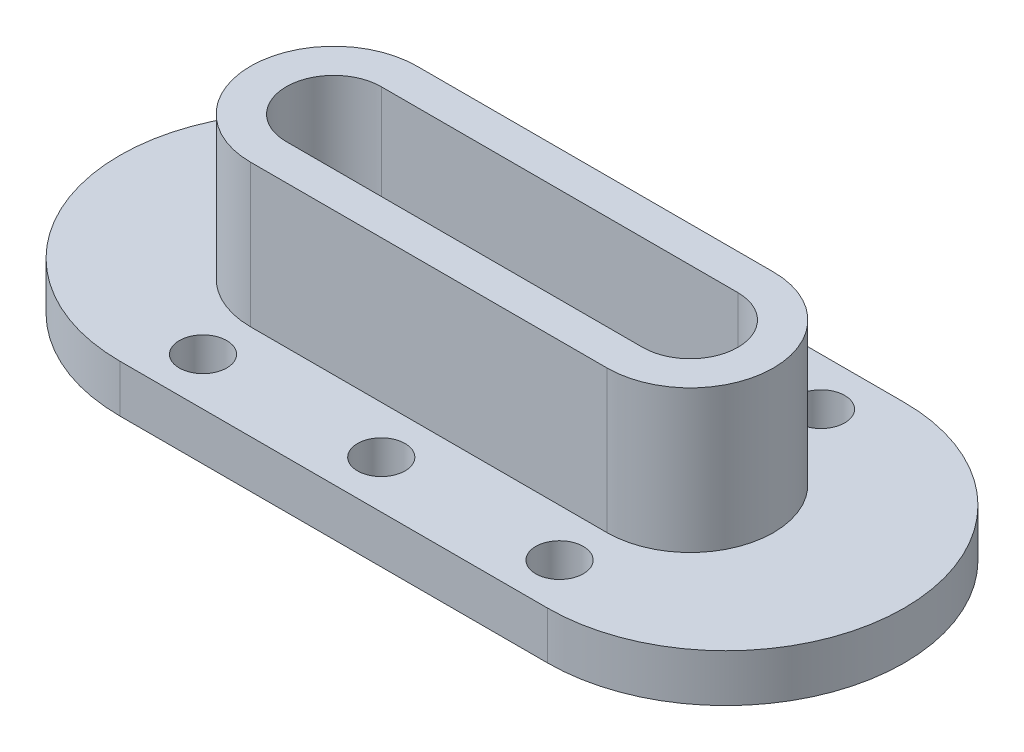
ISO-10303-21;
HEADER;
FILE_DESCRIPTION(('STEP AP214'),'2;1');
FILE_NAME('part.step','',(''),(''),'','','');
FILE_SCHEMA(('AUTOMOTIVE_DESIGN { 1 0 10303 214 1 1 1 1 }'));
ENDSEC;
DATA;
#1=APPLICATION_CONTEXT('core data for automotive mechanical design processes');
#2=APPLICATION_PROTOCOL_DEFINITION('international standard','automotive_design',2000,#1);
#3=PRODUCT_CONTEXT('',#1,'mechanical');
#4=PRODUCT('Part','Part','',(#3));
#5=PRODUCT_RELATED_PRODUCT_CATEGORY('part','',(#4));
#6=PRODUCT_DEFINITION_FORMATION('','',#4);
#7=PRODUCT_DEFINITION_CONTEXT('part definition',#1,'design');
#8=PRODUCT_DEFINITION('design','',#6,#7);
#9=PRODUCT_DEFINITION_SHAPE('','',#8);
#10=(LENGTH_UNIT() NAMED_UNIT(*) SI_UNIT(.MILLI.,.METRE.));
#11=(NAMED_UNIT(*) PLANE_ANGLE_UNIT() SI_UNIT($,.RADIAN.));
#12=(NAMED_UNIT(*) SI_UNIT($,.STERADIAN.) SOLID_ANGLE_UNIT());
#13=UNCERTAINTY_MEASURE_WITH_UNIT(LENGTH_MEASURE(1.E-05),#10,'distance_accuracy_value','');
#14=(GEOMETRIC_REPRESENTATION_CONTEXT(3) GLOBAL_UNCERTAINTY_ASSIGNED_CONTEXT((#13)) GLOBAL_UNIT_ASSIGNED_CONTEXT((#10,
#11,#12)) REPRESENTATION_CONTEXT('',''));
#15=CARTESIAN_POINT('',(0.,0.,0.));
#16=DIRECTION('',(0.,0.,1.));
#17=DIRECTION('',(1.,0.,0.));
#18=AXIS2_PLACEMENT_3D('',#15,#16,#17);
#19=CARTESIAN_POINT('',(-90.,10.,0.));
#20=DIRECTION('',(0.,1.,0.));
#21=DIRECTION('',(0.,0.,1.));
#22=AXIS2_PLACEMENT_3D('',#19,#20,#21);
#23=PLANE('',#22);
#24=CARTESIAN_POINT('',(75.,10.,-55.));
#25=DIRECTION('',(0.,1.,0.));
#26=DIRECTION('',(0.,0.,1.));
#27=AXIS2_PLACEMENT_3D('',#24,#25,#26);
#28=CIRCLE('',#27,10.);
#29=CARTESIAN_POINT('',(75.,10.,-45.));
#30=VERTEX_POINT('',#29);
#31=EDGE_CURVE('E337',#30,#30,#28,.T.);
#32=ORIENTED_EDGE('',*,*,#31,.F.);
#33=EDGE_LOOP('',(#32));
#34=FACE_BOUND('',#33,.T.);
#35=CARTESIAN_POINT('',(0.,10.,-55.));
#36=DIRECTION('',(0.,1.,0.));
#37=DIRECTION('',(0.,0.,1.));
#38=AXIS2_PLACEMENT_3D('',#35,#36,#37);
#39=CIRCLE('',#38,10.);
#40=CARTESIAN_POINT('',(0.,10.,-45.));
#41=VERTEX_POINT('',#40);
#42=EDGE_CURVE('E350',#41,#41,#39,.T.);
#43=ORIENTED_EDGE('',*,*,#42,.F.);
#44=EDGE_LOOP('',(#43));
#45=FACE_BOUND('',#44,.T.);
#46=CARTESIAN_POINT('',(-75.,10.,-55.));
#47=DIRECTION('',(0.,1.,0.));
#48=DIRECTION('',(0.,0.,1.));
#49=AXIS2_PLACEMENT_3D('',#46,#47,#48);
#50=CIRCLE('',#49,10.);
#51=CARTESIAN_POINT('',(-75.,10.,-45.));
#52=VERTEX_POINT('',#51);
#53=EDGE_CURVE('E358',#52,#52,#50,.T.);
#54=ORIENTED_EDGE('',*,*,#53,.F.);
#55=EDGE_LOOP('',(#54));
#56=FACE_BOUND('',#55,.T.);
#57=CARTESIAN_POINT('',(75.,10.,55.));
#58=DIRECTION('',(0.,1.,0.));
#59=DIRECTION('',(0.,0.,1.));
#60=AXIS2_PLACEMENT_3D('',#57,#58,#59);
#61=CIRCLE('',#60,10.);
#62=CARTESIAN_POINT('',(75.,10.,65.));
#63=VERTEX_POINT('',#62);
#64=EDGE_CURVE('E366',#63,#63,#61,.T.);
#65=ORIENTED_EDGE('',*,*,#64,.F.);
#66=EDGE_LOOP('',(#65));
#67=FACE_BOUND('',#66,.T.);
#68=CARTESIAN_POINT('',(0.,10.,55.));
#69=DIRECTION('',(0.,1.,0.));
#70=DIRECTION('',(0.,0.,1.));
#71=AXIS2_PLACEMENT_3D('',#68,#69,#70);
#72=CIRCLE('',#71,10.);
#73=CARTESIAN_POINT('',(0.,10.,65.));
#74=VERTEX_POINT('',#73);
#75=EDGE_CURVE('E374',#74,#74,#72,.T.);
#76=ORIENTED_EDGE('',*,*,#75,.F.);
#77=EDGE_LOOP('',(#76));
#78=FACE_BOUND('',#77,.T.);
#79=CARTESIAN_POINT('',(-75.,10.,55.));
#80=DIRECTION('',(0.,1.,0.));
#81=DIRECTION('',(0.,0.,1.));
#82=AXIS2_PLACEMENT_3D('',#79,#80,#81);
#83=CIRCLE('',#82,10.);
#84=CARTESIAN_POINT('',(-75.,10.,65.));
#85=VERTEX_POINT('',#84);
#86=EDGE_CURVE('E382',#85,#85,#83,.T.);
#87=ORIENTED_EDGE('',*,*,#86,.F.);
#88=EDGE_LOOP('',(#87));
#89=FACE_BOUND('',#88,.T.);
#90=CARTESIAN_POINT('',(-90.,10.,0.));
#91=DIRECTION('',(0.,1.,0.));
#92=DIRECTION('',(0.,0.,1.));
#93=AXIS2_PLACEMENT_3D('',#90,#91,#92);
#94=CIRCLE('',#93,75.);
#95=CARTESIAN_POINT('',(-90.,10.,-75.));
#96=VERTEX_POINT('',#95);
#97=CARTESIAN_POINT('',(-90.,10.,75.));
#98=VERTEX_POINT('',#97);
#99=EDGE_CURVE('E229',#96,#98,#94,.T.);
#100=ORIENTED_EDGE('',*,*,#99,.T.);
#101=DIRECTION('',(1.,0.,0.));
#102=VECTOR('',#101,1.);
#103=CARTESIAN_POINT('',(-90.,10.,75.));
#104=LINE('',#103,#102);
#105=CARTESIAN_POINT('',(90.,10.,75.));
#106=VERTEX_POINT('',#105);
#107=EDGE_CURVE('E233',#98,#106,#104,.T.);
#108=ORIENTED_EDGE('',*,*,#107,.T.);
#109=CARTESIAN_POINT('',(90.,10.,0.));
#110=DIRECTION('',(0.,1.,0.));
#111=DIRECTION('',(0.,0.,1.));
#112=AXIS2_PLACEMENT_3D('',#109,#110,#111);
#113=CIRCLE('',#112,75.);
#114=CARTESIAN_POINT('',(90.,10.,-75.0000000000001));
#115=VERTEX_POINT('',#114);
#116=EDGE_CURVE('E237',#106,#115,#113,.T.);
#117=ORIENTED_EDGE('',*,*,#116,.T.);
#118=DIRECTION('',(-1.,0.,0.));
#119=VECTOR('',#118,1.);
#120=CARTESIAN_POINT('',(-90.,10.,-75.));
#121=LINE('',#120,#119);
#122=EDGE_CURVE('E240',#115,#96,#121,.T.);
#123=ORIENTED_EDGE('',*,*,#122,.T.);
#124=EDGE_LOOP('',(#100,#108,#117,#123));
#125=FACE_BOUND('',#124,.T.);
#126=DIRECTION('',(1.,0.,0.));
#127=VECTOR('',#126,1.);
#128=CARTESIAN_POINT('',(-75.,10.,35.));
#129=LINE('',#128,#127);
#130=CARTESIAN_POINT('',(-75.,10.,35.));
#131=VERTEX_POINT('',#130);
#132=CARTESIAN_POINT('',(75.,10.,35.));
#133=VERTEX_POINT('',#132);
#134=EDGE_CURVE('E208',#131,#133,#129,.T.);
#135=ORIENTED_EDGE('',*,*,#134,.F.);
#136=CARTESIAN_POINT('',(-75.,10.,0.));
#137=DIRECTION('',(0.,1.,0.));
#138=DIRECTION('',(0.,0.,1.));
#139=AXIS2_PLACEMENT_3D('',#136,#137,#138);
#140=CIRCLE('',#139,35.);
#141=CARTESIAN_POINT('',(-75.,10.,-35.));
#142=VERTEX_POINT('',#141);
#143=EDGE_CURVE('E156',#142,#131,#140,.T.);
#144=ORIENTED_EDGE('',*,*,#143,.F.);
#145=DIRECTION('',(-1.,0.,0.));
#146=VECTOR('',#145,1.);
#147=CARTESIAN_POINT('',(-75.,10.,-35.));
#148=LINE('',#147,#146);
#149=CARTESIAN_POINT('',(75.,10.,-35.0000000000001));
#150=VERTEX_POINT('',#149);
#151=EDGE_CURVE('E195',#150,#142,#148,.T.);
#152=ORIENTED_EDGE('',*,*,#151,.F.);
#153=CARTESIAN_POINT('',(75.,10.,0.));
#154=DIRECTION('',(0.,1.,0.));
#155=DIRECTION('',(0.,0.,1.));
#156=AXIS2_PLACEMENT_3D('',#153,#154,#155);
#157=CIRCLE('',#156,35.);
#158=EDGE_CURVE('E211',#133,#150,#157,.T.);
#159=ORIENTED_EDGE('',*,*,#158,.F.);
#160=EDGE_LOOP('',(#135,#144,#152,#159));
#161=FACE_BOUND('',#160,.T.);
#162=ADVANCED_FACE('F45',(#34,#45,#56,#67,#78,#89,#125,#161),#23,.T.);
#163=CARTESIAN_POINT('',(-90.,10.,0.));
#164=DIRECTION('',(0.,-1.,0.));
#165=DIRECTION('',(0.,0.,-1.));
#166=AXIS2_PLACEMENT_3D('',#163,#164,#165);
#167=CYLINDRICAL_SURFACE('',#166,75.);
#168=CARTESIAN_POINT('',(-90.,-10.,0.));
#169=DIRECTION('',(0.,1.,0.));
#170=DIRECTION('',(0.,0.,1.));
#171=AXIS2_PLACEMENT_3D('',#168,#169,#170);
#172=CIRCLE('',#171,75.);
#173=CARTESIAN_POINT('',(-90.,-10.,-75.));
#174=VERTEX_POINT('',#173);
#175=CARTESIAN_POINT('',(-90.,-10.,75.));
#176=VERTEX_POINT('',#175);
#177=EDGE_CURVE('E228',#174,#176,#172,.T.);
#178=ORIENTED_EDGE('',*,*,#177,.T.);
#179=DIRECTION('',(0.,-1.,0.));
#180=VECTOR('',#179,1.);
#181=CARTESIAN_POINT('',(-90.,10.,75.));
#182=LINE('',#181,#180);
#183=EDGE_CURVE('E11',#98,#176,#182,.T.);
#184=ORIENTED_EDGE('',*,*,#183,.F.);
#185=ORIENTED_EDGE('',*,*,#99,.F.);
#186=DIRECTION('',(0.,-1.,0.));
#187=VECTOR('',#186,1.);
#188=CARTESIAN_POINT('',(-90.,10.,-75.));
#189=LINE('',#188,#187);
#190=EDGE_CURVE('E243',#96,#174,#189,.T.);
#191=ORIENTED_EDGE('',*,*,#190,.T.);
#192=EDGE_LOOP('',(#178,#184,#185,#191));
#193=FACE_BOUND('',#192,.T.);
#194=ADVANCED_FACE('F47',(#193),#167,.T.);
#195=CARTESIAN_POINT('',(-90.,10.,75.));
#196=DIRECTION('',(0.,0.,-1.));
#197=DIRECTION('',(-1.,0.,0.));
#198=AXIS2_PLACEMENT_3D('',#195,#196,#197);
#199=PLANE('',#198);
#200=DIRECTION('',(1.,0.,0.));
#201=VECTOR('',#200,1.);
#202=CARTESIAN_POINT('',(-90.,-10.,75.));
#203=LINE('',#202,#201);
#204=CARTESIAN_POINT('',(90.,-10.,75.));
#205=VERTEX_POINT('',#204);
#206=EDGE_CURVE('E247',#176,#205,#203,.T.);
#207=ORIENTED_EDGE('',*,*,#206,.T.);
#208=DIRECTION('',(0.,-1.,0.));
#209=VECTOR('',#208,1.);
#210=CARTESIAN_POINT('',(90.,10.,75.));
#211=LINE('',#210,#209);
#212=EDGE_CURVE('E54',#106,#205,#211,.T.);
#213=ORIENTED_EDGE('',*,*,#212,.F.);
#214=ORIENTED_EDGE('',*,*,#107,.F.);
#215=ORIENTED_EDGE('',*,*,#183,.T.);
#216=EDGE_LOOP('',(#207,#213,#214,#215));
#217=FACE_BOUND('',#216,.T.);
#218=ADVANCED_FACE('F283',(#217),#199,.F.);
#219=CARTESIAN_POINT('',(90.,10.,0.));
#220=DIRECTION('',(0.,-1.,0.));
#221=DIRECTION('',(0.,0.,-1.));
#222=AXIS2_PLACEMENT_3D('',#219,#220,#221);
#223=CYLINDRICAL_SURFACE('',#222,75.);
#224=CARTESIAN_POINT('',(90.,-10.,0.));
#225=DIRECTION('',(0.,1.,0.));
#226=DIRECTION('',(0.,0.,1.));
#227=AXIS2_PLACEMENT_3D('',#224,#225,#226);
#228=CIRCLE('',#227,75.);
#229=CARTESIAN_POINT('',(90.,-10.,-75.0000000000001));
#230=VERTEX_POINT('',#229);
#231=EDGE_CURVE('E250',#205,#230,#228,.T.);
#232=ORIENTED_EDGE('',*,*,#231,.T.);
#233=DIRECTION('',(0.,-1.,0.));
#234=VECTOR('',#233,1.);
#235=CARTESIAN_POINT('',(90.,10.,-75.0000000000001));
#236=LINE('',#235,#234);
#237=EDGE_CURVE('E258',#115,#230,#236,.T.);
#238=ORIENTED_EDGE('',*,*,#237,.F.);
#239=ORIENTED_EDGE('',*,*,#116,.F.);
#240=ORIENTED_EDGE('',*,*,#212,.T.);
#241=EDGE_LOOP('',(#232,#238,#239,#240));
#242=FACE_BOUND('',#241,.T.);
#243=ADVANCED_FACE('F267',(#242),#223,.T.);
#244=CARTESIAN_POINT('',(-90.,10.,-75.));
#245=DIRECTION('',(0.,0.,1.));
#246=DIRECTION('',(1.,0.,0.));
#247=AXIS2_PLACEMENT_3D('',#244,#245,#246);
#248=PLANE('',#247);
#249=DIRECTION('',(-1.,0.,0.));
#250=VECTOR('',#249,1.);
#251=CARTESIAN_POINT('',(-90.,-10.,-75.));
#252=LINE('',#251,#250);
#253=EDGE_CURVE('E234',#230,#174,#252,.T.);
#254=ORIENTED_EDGE('',*,*,#253,.T.);
#255=ORIENTED_EDGE('',*,*,#190,.F.);
#256=ORIENTED_EDGE('',*,*,#122,.F.);
#257=ORIENTED_EDGE('',*,*,#237,.T.);
#258=EDGE_LOOP('',(#254,#255,#256,#257));
#259=FACE_BOUND('',#258,.T.);
#260=ADVANCED_FACE('F276',(#259),#248,.F.);
#261=CARTESIAN_POINT('',(-90.,-10.,0.));
#262=DIRECTION('',(0.,1.,0.));
#263=DIRECTION('',(0.,0.,1.));
#264=AXIS2_PLACEMENT_3D('',#261,#262,#263);
#265=PLANE('',#264);
#266=CARTESIAN_POINT('',(0.,-10.,0.));
#267=DIRECTION('',(0.,1.,0.));
#268=DIRECTION('',(0.,0.,1.));
#269=AXIS2_PLACEMENT_3D('',#266,#267,#268);
#270=CIRCLE('',#269,7.50000000000001);
#271=CARTESIAN_POINT('',(0.,-10.,7.50000000000001));
#272=VERTEX_POINT('',#271);
#273=EDGE_CURVE('E405',#272,#272,#270,.T.);
#274=ORIENTED_EDGE('',*,*,#273,.T.);
#275=EDGE_LOOP('',(#274));
#276=FACE_BOUND('',#275,.T.);
#277=CARTESIAN_POINT('',(75.,-10.,0.));
#278=DIRECTION('',(0.,1.,0.));
#279=DIRECTION('',(0.,0.,1.));
#280=AXIS2_PLACEMENT_3D('',#277,#278,#279);
#281=CIRCLE('',#280,7.50000000000001);
#282=CARTESIAN_POINT('',(75.,-10.,7.49999999999999));
#283=VERTEX_POINT('',#282);
#284=EDGE_CURVE('E332',#283,#283,#281,.T.);
#285=ORIENTED_EDGE('',*,*,#284,.T.);
#286=EDGE_LOOP('',(#285));
#287=FACE_BOUND('',#286,.T.);
#288=CARTESIAN_POINT('',(-75.,-10.,0.));
#289=DIRECTION('',(0.,1.,0.));
#290=DIRECTION('',(0.,0.,1.));
#291=AXIS2_PLACEMENT_3D('',#288,#289,#290);
#292=CIRCLE('',#291,7.50000000000001);
#293=CARTESIAN_POINT('',(-75.,-10.,7.50000000000001));
#294=VERTEX_POINT('',#293);
#295=EDGE_CURVE('E331',#294,#294,#292,.T.);
#296=ORIENTED_EDGE('',*,*,#295,.T.);
#297=EDGE_LOOP('',(#296));
#298=FACE_BOUND('',#297,.T.);
#299=CARTESIAN_POINT('',(75.,-10.,-55.));
#300=DIRECTION('',(0.,1.,0.));
#301=DIRECTION('',(0.,0.,1.));
#302=AXIS2_PLACEMENT_3D('',#299,#300,#301);
#303=CIRCLE('',#302,10.);
#304=CARTESIAN_POINT('',(75.,-10.,-45.));
#305=VERTEX_POINT('',#304);
#306=EDGE_CURVE('E346',#305,#305,#303,.T.);
#307=ORIENTED_EDGE('',*,*,#306,.T.);
#308=EDGE_LOOP('',(#307));
#309=FACE_BOUND('',#308,.T.);
#310=CARTESIAN_POINT('',(0.,-10.,-55.));
#311=DIRECTION('',(0.,1.,0.));
#312=DIRECTION('',(0.,0.,1.));
#313=AXIS2_PLACEMENT_3D('',#310,#311,#312);
#314=CIRCLE('',#313,10.);
#315=CARTESIAN_POINT('',(0.,-10.,-45.));
#316=VERTEX_POINT('',#315);
#317=EDGE_CURVE('E354',#316,#316,#314,.T.);
#318=ORIENTED_EDGE('',*,*,#317,.T.);
#319=EDGE_LOOP('',(#318));
#320=FACE_BOUND('',#319,.T.);
#321=CARTESIAN_POINT('',(-75.,-10.,-55.));
#322=DIRECTION('',(0.,1.,0.));
#323=DIRECTION('',(0.,0.,1.));
#324=AXIS2_PLACEMENT_3D('',#321,#322,#323);
#325=CIRCLE('',#324,10.);
#326=CARTESIAN_POINT('',(-75.,-10.,-45.));
#327=VERTEX_POINT('',#326);
#328=EDGE_CURVE('E362',#327,#327,#325,.T.);
#329=ORIENTED_EDGE('',*,*,#328,.T.);
#330=EDGE_LOOP('',(#329));
#331=FACE_BOUND('',#330,.T.);
#332=CARTESIAN_POINT('',(75.,-10.,55.));
#333=DIRECTION('',(0.,1.,0.));
#334=DIRECTION('',(0.,0.,1.));
#335=AXIS2_PLACEMENT_3D('',#332,#333,#334);
#336=CIRCLE('',#335,10.);
#337=CARTESIAN_POINT('',(75.,-10.,65.));
#338=VERTEX_POINT('',#337);
#339=EDGE_CURVE('E370',#338,#338,#336,.T.);
#340=ORIENTED_EDGE('',*,*,#339,.T.);
#341=EDGE_LOOP('',(#340));
#342=FACE_BOUND('',#341,.T.);
#343=CARTESIAN_POINT('',(0.,-10.,55.));
#344=DIRECTION('',(0.,1.,0.));
#345=DIRECTION('',(0.,0.,1.));
#346=AXIS2_PLACEMENT_3D('',#343,#344,#345);
#347=CIRCLE('',#346,10.);
#348=CARTESIAN_POINT('',(0.,-10.,65.));
#349=VERTEX_POINT('',#348);
#350=EDGE_CURVE('E378',#349,#349,#347,.T.);
#351=ORIENTED_EDGE('',*,*,#350,.T.);
#352=EDGE_LOOP('',(#351));
#353=FACE_BOUND('',#352,.T.);
#354=CARTESIAN_POINT('',(-75.,-10.,55.));
#355=DIRECTION('',(0.,1.,0.));
#356=DIRECTION('',(0.,0.,1.));
#357=AXIS2_PLACEMENT_3D('',#354,#355,#356);
#358=CIRCLE('',#357,10.);
#359=CARTESIAN_POINT('',(-75.,-10.,65.));
#360=VERTEX_POINT('',#359);
#361=EDGE_CURVE('E174',#360,#360,#358,.T.);
#362=ORIENTED_EDGE('',*,*,#361,.T.);
#363=EDGE_LOOP('',(#362));
#364=FACE_BOUND('',#363,.T.);
#365=ORIENTED_EDGE('',*,*,#177,.F.);
#366=ORIENTED_EDGE('',*,*,#253,.F.);
#367=ORIENTED_EDGE('',*,*,#231,.F.);
#368=ORIENTED_EDGE('',*,*,#206,.F.);
#369=EDGE_LOOP('',(#365,#366,#367,#368));
#370=FACE_BOUND('',#369,.T.);
#371=ADVANCED_FACE('F273',(#276,#287,#298,#309,#320,#331,#342,#353,#364,#370),#265,.F.);
#372=CARTESIAN_POINT('',(-75.,70.,0.));
#373=DIRECTION('',(0.,1.,0.));
#374=DIRECTION('',(0.,0.,1.));
#375=AXIS2_PLACEMENT_3D('',#372,#373,#374);
#376=PLANE('',#375);
#377=CARTESIAN_POINT('',(-75.,70.,0.));
#378=DIRECTION('',(0.,1.,0.));
#379=DIRECTION('',(0.,0.,1.));
#380=AXIS2_PLACEMENT_3D('',#377,#378,#379);
#381=CIRCLE('',#380,35.);
#382=CARTESIAN_POINT('',(-75.,70.,-35.));
#383=VERTEX_POINT('',#382);
#384=CARTESIAN_POINT('',(-75.,70.,35.));
#385=VERTEX_POINT('',#384);
#386=EDGE_CURVE('E190',#383,#385,#381,.T.);
#387=ORIENTED_EDGE('',*,*,#386,.T.);
#388=DIRECTION('',(1.,0.,0.));
#389=VECTOR('',#388,1.);
#390=CARTESIAN_POINT('',(-75.,70.,35.));
#391=LINE('',#390,#389);
#392=CARTESIAN_POINT('',(75.,70.,35.));
#393=VERTEX_POINT('',#392);
#394=EDGE_CURVE('E194',#385,#393,#391,.T.);
#395=ORIENTED_EDGE('',*,*,#394,.T.);
#396=CARTESIAN_POINT('',(75.,70.,0.));
#397=DIRECTION('',(0.,1.,0.));
#398=DIRECTION('',(0.,0.,1.));
#399=AXIS2_PLACEMENT_3D('',#396,#397,#398);
#400=CIRCLE('',#399,35.);
#401=CARTESIAN_POINT('',(75.,70.,-35.0000000000001));
#402=VERTEX_POINT('',#401);
#403=EDGE_CURVE('E198',#393,#402,#400,.T.);
#404=ORIENTED_EDGE('',*,*,#403,.T.);
#405=DIRECTION('',(-1.,0.,0.));
#406=VECTOR('',#405,1.);
#407=CARTESIAN_POINT('',(-75.,70.,-35.));
#408=LINE('',#407,#406);
#409=EDGE_CURVE('E201',#402,#383,#408,.T.);
#410=ORIENTED_EDGE('',*,*,#409,.T.);
#411=EDGE_LOOP('',(#387,#395,#404,#410));
#412=FACE_BOUND('',#411,.T.);
#413=DIRECTION('',(1.,0.,0.));
#414=VECTOR('',#413,1.);
#415=CARTESIAN_POINT('',(-75.,70.,20.));
#416=LINE('',#415,#414);
#417=CARTESIAN_POINT('',(-75.,70.,20.));
#418=VERTEX_POINT('',#417);
#419=CARTESIAN_POINT('',(75.,70.,20.));
#420=VERTEX_POINT('',#419);
#421=EDGE_CURVE('E147',#418,#420,#416,.T.);
#422=ORIENTED_EDGE('',*,*,#421,.F.);
#423=CARTESIAN_POINT('',(-75.,70.,0.));
#424=DIRECTION('',(0.,1.,0.));
#425=DIRECTION('',(0.,0.,1.));
#426=AXIS2_PLACEMENT_3D('',#423,#424,#425);
#427=CIRCLE('',#426,20.);
#428=CARTESIAN_POINT('',(-75.,70.,-20.));
#429=VERTEX_POINT('',#428);
#430=EDGE_CURVE('E137',#429,#418,#427,.T.);
#431=ORIENTED_EDGE('',*,*,#430,.F.);
#432=DIRECTION('',(-1.,0.,0.));
#433=VECTOR('',#432,1.);
#434=CARTESIAN_POINT('',(-75.,70.,-20.));
#435=LINE('',#434,#433);
#436=CARTESIAN_POINT('',(75.,70.,-20.0000000000001));
#437=VERTEX_POINT('',#436);
#438=EDGE_CURVE('E166',#437,#429,#435,.T.);
#439=ORIENTED_EDGE('',*,*,#438,.F.);
#440=CARTESIAN_POINT('',(75.,70.,0.));
#441=DIRECTION('',(0.,1.,0.));
#442=DIRECTION('',(0.,0.,1.));
#443=AXIS2_PLACEMENT_3D('',#440,#441,#442);
#444=CIRCLE('',#443,20.);
#445=EDGE_CURVE('E162',#420,#437,#444,.T.);
#446=ORIENTED_EDGE('',*,*,#445,.F.);
#447=EDGE_LOOP('',(#422,#431,#439,#446));
#448=FACE_BOUND('',#447,.T.);
#449=ADVANCED_FACE('F160',(#412,#448),#376,.T.);
#450=CARTESIAN_POINT('',(-75.,70.,0.));
#451=DIRECTION('',(0.,-1.,0.));
#452=DIRECTION('',(0.,0.,-1.));
#453=AXIS2_PLACEMENT_3D('',#450,#451,#452);
#454=CYLINDRICAL_SURFACE('',#453,35.);
#455=ORIENTED_EDGE('',*,*,#143,.T.);
#456=DIRECTION('',(0.,-1.,0.));
#457=VECTOR('',#456,1.);
#458=CARTESIAN_POINT('',(-75.,70.,35.));
#459=LINE('',#458,#457);
#460=EDGE_CURVE('E225',#385,#131,#459,.T.);
#461=ORIENTED_EDGE('',*,*,#460,.F.);
#462=ORIENTED_EDGE('',*,*,#386,.F.);
#463=DIRECTION('',(0.,-1.,0.));
#464=VECTOR('',#463,1.);
#465=CARTESIAN_POINT('',(-75.,70.,-35.));
#466=LINE('',#465,#464);
#467=EDGE_CURVE('E204',#383,#142,#466,.T.);
#468=ORIENTED_EDGE('',*,*,#467,.T.);
#469=EDGE_LOOP('',(#455,#461,#462,#468));
#470=FACE_BOUND('',#469,.T.);
#471=ADVANCED_FACE('F397',(#470),#454,.T.);
#472=CARTESIAN_POINT('',(-75.,70.,35.));
#473=DIRECTION('',(0.,0.,-1.));
#474=DIRECTION('',(-1.,0.,0.));
#475=AXIS2_PLACEMENT_3D('',#472,#473,#474);
#476=PLANE('',#475);
#477=ORIENTED_EDGE('',*,*,#134,.T.);
#478=DIRECTION('',(0.,-1.,0.));
#479=VECTOR('',#478,1.);
#480=CARTESIAN_POINT('',(75.,70.,35.));
#481=LINE('',#480,#479);
#482=EDGE_CURVE('E221',#393,#133,#481,.T.);
#483=ORIENTED_EDGE('',*,*,#482,.F.);
#484=ORIENTED_EDGE('',*,*,#394,.F.);
#485=ORIENTED_EDGE('',*,*,#460,.T.);
#486=EDGE_LOOP('',(#477,#483,#484,#485));
#487=FACE_BOUND('',#486,.T.);
#488=ADVANCED_FACE('F446',(#487),#476,.F.);
#489=CARTESIAN_POINT('',(75.,70.,0.));
#490=DIRECTION('',(0.,-1.,0.));
#491=DIRECTION('',(0.,0.,-1.));
#492=AXIS2_PLACEMENT_3D('',#489,#490,#491);
#493=CYLINDRICAL_SURFACE('',#492,35.);
#494=ORIENTED_EDGE('',*,*,#158,.T.);
#495=DIRECTION('',(0.,-1.,0.));
#496=VECTOR('',#495,1.);
#497=CARTESIAN_POINT('',(75.,70.,-35.0000000000001));
#498=LINE('',#497,#496);
#499=EDGE_CURVE('E61',#402,#150,#498,.T.);
#500=ORIENTED_EDGE('',*,*,#499,.F.);
#501=ORIENTED_EDGE('',*,*,#403,.F.);
#502=ORIENTED_EDGE('',*,*,#482,.T.);
#503=EDGE_LOOP('',(#494,#500,#501,#502));
#504=FACE_BOUND('',#503,.T.);
#505=ADVANCED_FACE('F443',(#504),#493,.T.);
#506=CARTESIAN_POINT('',(-75.,70.,-35.));
#507=DIRECTION('',(0.,0.,1.));
#508=DIRECTION('',(1.,0.,0.));
#509=AXIS2_PLACEMENT_3D('',#506,#507,#508);
#510=PLANE('',#509);
#511=ORIENTED_EDGE('',*,*,#151,.T.);
#512=ORIENTED_EDGE('',*,*,#467,.F.);
#513=ORIENTED_EDGE('',*,*,#409,.F.);
#514=ORIENTED_EDGE('',*,*,#499,.T.);
#515=EDGE_LOOP('',(#511,#512,#513,#514));
#516=FACE_BOUND('',#515,.T.);
#517=ADVANCED_FACE('F439',(#516),#510,.F.);
#518=CARTESIAN_POINT('',(-75.,70.,0.));
#519=DIRECTION('',(0.,-1.,0.));
#520=DIRECTION('',(0.,0.,-1.));
#521=AXIS2_PLACEMENT_3D('',#518,#519,#520);
#522=CYLINDRICAL_SURFACE('',#521,20.);
#523=CARTESIAN_POINT('',(-75.,10.,0.));
#524=DIRECTION('',(0.,1.,0.));
#525=DIRECTION('',(0.,0.,1.));
#526=AXIS2_PLACEMENT_3D('',#523,#524,#525);
#527=CIRCLE('',#526,20.);
#528=CARTESIAN_POINT('',(-75.,10.,-20.));
#529=VERTEX_POINT('',#528);
#530=CARTESIAN_POINT('',(-75.,10.,20.));
#531=VERTEX_POINT('',#530);
#532=EDGE_CURVE('E69',#529,#531,#527,.T.);
#533=ORIENTED_EDGE('',*,*,#532,.F.);
#534=DIRECTION('',(0.,-1.,0.));
#535=VECTOR('',#534,1.);
#536=CARTESIAN_POINT('',(-75.,70.,-20.));
#537=LINE('',#536,#535);
#538=EDGE_CURVE('E142',#429,#529,#537,.T.);
#539=ORIENTED_EDGE('',*,*,#538,.F.);
#540=ORIENTED_EDGE('',*,*,#430,.T.);
#541=DIRECTION('',(0.,-1.,0.));
#542=VECTOR('',#541,1.);
#543=CARTESIAN_POINT('',(-75.,70.,20.));
#544=LINE('',#543,#542);
#545=EDGE_CURVE('E140',#418,#531,#544,.T.);
#546=ORIENTED_EDGE('',*,*,#545,.T.);
#547=EDGE_LOOP('',(#533,#539,#540,#546));
#548=FACE_BOUND('',#547,.T.);
#549=ADVANCED_FACE('F139',(#548),#522,.F.);
#550=CARTESIAN_POINT('',(-75.,70.,20.));
#551=DIRECTION('',(0.,0.,-1.));
#552=DIRECTION('',(-1.,0.,0.));
#553=AXIS2_PLACEMENT_3D('',#550,#551,#552);
#554=PLANE('',#553);
#555=DIRECTION('',(1.,0.,0.));
#556=VECTOR('',#555,1.);
#557=CARTESIAN_POINT('',(-75.,10.,20.));
#558=LINE('',#557,#556);
#559=CARTESIAN_POINT('',(75.,10.,20.));
#560=VERTEX_POINT('',#559);
#561=EDGE_CURVE('E154',#531,#560,#558,.T.);
#562=ORIENTED_EDGE('',*,*,#561,.F.);
#563=ORIENTED_EDGE('',*,*,#545,.F.);
#564=ORIENTED_EDGE('',*,*,#421,.T.);
#565=DIRECTION('',(0.,-1.,0.));
#566=VECTOR('',#565,1.);
#567=CARTESIAN_POINT('',(75.,70.,20.));
#568=LINE('',#567,#566);
#569=EDGE_CURVE('E157',#420,#560,#568,.T.);
#570=ORIENTED_EDGE('',*,*,#569,.T.);
#571=EDGE_LOOP('',(#562,#563,#564,#570));
#572=FACE_BOUND('',#571,.T.);
#573=ADVANCED_FACE('F151',(#572),#554,.T.);
#574=CARTESIAN_POINT('',(75.,70.,0.));
#575=DIRECTION('',(0.,-1.,0.));
#576=DIRECTION('',(0.,0.,-1.));
#577=AXIS2_PLACEMENT_3D('',#574,#575,#576);
#578=CYLINDRICAL_SURFACE('',#577,20.);
#579=CARTESIAN_POINT('',(75.,10.,0.));
#580=DIRECTION('',(0.,1.,0.));
#581=DIRECTION('',(0.,0.,1.));
#582=AXIS2_PLACEMENT_3D('',#579,#580,#581);
#583=CIRCLE('',#582,20.);
#584=CARTESIAN_POINT('',(75.,10.,-20.0000000000001));
#585=VERTEX_POINT('',#584);
#586=EDGE_CURVE('E177',#560,#585,#583,.T.);
#587=ORIENTED_EDGE('',*,*,#586,.F.);
#588=ORIENTED_EDGE('',*,*,#569,.F.);
#589=ORIENTED_EDGE('',*,*,#445,.T.);
#590=DIRECTION('',(0.,-1.,0.));
#591=VECTOR('',#590,1.);
#592=CARTESIAN_POINT('',(75.,70.,-20.0000000000001));
#593=LINE('',#592,#591);
#594=EDGE_CURVE('E184',#437,#585,#593,.T.);
#595=ORIENTED_EDGE('',*,*,#594,.T.);
#596=EDGE_LOOP('',(#587,#588,#589,#595));
#597=FACE_BOUND('',#596,.T.);
#598=ADVANCED_FACE('F315',(#597),#578,.F.);
#599=CARTESIAN_POINT('',(-75.,70.,-20.));
#600=DIRECTION('',(0.,0.,1.));
#601=DIRECTION('',(1.,0.,0.));
#602=AXIS2_PLACEMENT_3D('',#599,#600,#601);
#603=PLANE('',#602);
#604=DIRECTION('',(-1.,0.,0.));
#605=VECTOR('',#604,1.);
#606=CARTESIAN_POINT('',(-75.,10.,-20.));
#607=LINE('',#606,#605);
#608=EDGE_CURVE('E148',#585,#529,#607,.T.);
#609=ORIENTED_EDGE('',*,*,#608,.F.);
#610=ORIENTED_EDGE('',*,*,#594,.F.);
#611=ORIENTED_EDGE('',*,*,#438,.T.);
#612=ORIENTED_EDGE('',*,*,#538,.T.);
#613=EDGE_LOOP('',(#609,#610,#611,#612));
#614=FACE_BOUND('',#613,.T.);
#615=ADVANCED_FACE('F304',(#614),#603,.T.);
#616=CARTESIAN_POINT('',(0.,10.,0.));
#617=DIRECTION('',(0.,1.,0.));
#618=DIRECTION('',(0.,0.,1.));
#619=AXIS2_PLACEMENT_3D('',#616,#617,#618);
#620=CIRCLE('',#619,7.50000000000001);
#621=CARTESIAN_POINT('',(0.,10.,7.50000000000001));
#622=VERTEX_POINT('',#621);
#623=EDGE_CURVE('E321',#622,#622,#620,.T.);
#624=ORIENTED_EDGE('',*,*,#623,.F.);
#625=EDGE_LOOP('',(#624));
#626=FACE_BOUND('',#625,.T.);
#627=CARTESIAN_POINT('',(75.,10.,0.));
#628=DIRECTION('',(0.,1.,0.));
#629=DIRECTION('',(0.,0.,1.));
#630=AXIS2_PLACEMENT_3D('',#627,#628,#629);
#631=CIRCLE('',#630,7.50000000000002);
#632=CARTESIAN_POINT('',(75.,10.,7.49999999999999));
#633=VERTEX_POINT('',#632);
#634=EDGE_CURVE('E325',#633,#633,#631,.T.);
#635=ORIENTED_EDGE('',*,*,#634,.F.);
#636=EDGE_LOOP('',(#635));
#637=FACE_BOUND('',#636,.T.);
#638=CARTESIAN_POINT('',(-75.,10.,0.));
#639=DIRECTION('',(0.,1.,0.));
#640=DIRECTION('',(0.,0.,1.));
#641=AXIS2_PLACEMENT_3D('',#638,#639,#640);
#642=CIRCLE('',#641,7.50000000000002);
#643=CARTESIAN_POINT('',(-75.,10.,7.50000000000002));
#644=VERTEX_POINT('',#643);
#645=EDGE_CURVE('E328',#644,#644,#642,.T.);
#646=ORIENTED_EDGE('',*,*,#645,.F.);
#647=EDGE_LOOP('',(#646));
#648=FACE_BOUND('',#647,.T.);
#649=ORIENTED_EDGE('',*,*,#532,.T.);
#650=ORIENTED_EDGE('',*,*,#561,.T.);
#651=ORIENTED_EDGE('',*,*,#586,.T.);
#652=ORIENTED_EDGE('',*,*,#608,.T.);
#653=EDGE_LOOP('',(#649,#650,#651,#652));
#654=FACE_BOUND('',#653,.T.);
#655=ADVANCED_FACE('F293',(#626,#637,#648,#654),#23,.T.);
#656=CARTESIAN_POINT('',(-75.,10.,55.));
#657=DIRECTION('',(0.,1.,0.));
#658=DIRECTION('',(0.,0.,1.));
#659=AXIS2_PLACEMENT_3D('',#656,#657,#658);
#660=CYLINDRICAL_SURFACE('',#659,10.);
#661=ORIENTED_EDGE('',*,*,#361,.F.);
#662=EDGE_LOOP('',(#661));
#663=FACE_BOUND('',#662,.T.);
#664=ORIENTED_EDGE('',*,*,#86,.T.);
#665=EDGE_LOOP('',(#664));
#666=FACE_BOUND('',#665,.T.);
#667=ADVANCED_FACE('F303',(#663,#666),#660,.F.);
#668=CARTESIAN_POINT('',(0.,10.,55.));
#669=DIRECTION('',(0.,1.,0.));
#670=DIRECTION('',(0.,0.,1.));
#671=AXIS2_PLACEMENT_3D('',#668,#669,#670);
#672=CYLINDRICAL_SURFACE('',#671,10.);
#673=ORIENTED_EDGE('',*,*,#350,.F.);
#674=EDGE_LOOP('',(#673));
#675=FACE_BOUND('',#674,.T.);
#676=ORIENTED_EDGE('',*,*,#75,.T.);
#677=EDGE_LOOP('',(#676));
#678=FACE_BOUND('',#677,.T.);
#679=ADVANCED_FACE('F311',(#675,#678),#672,.F.);
#680=CARTESIAN_POINT('',(75.,10.,55.));
#681=DIRECTION('',(0.,1.,0.));
#682=DIRECTION('',(0.,0.,1.));
#683=AXIS2_PLACEMENT_3D('',#680,#681,#682);
#684=CYLINDRICAL_SURFACE('',#683,10.);
#685=ORIENTED_EDGE('',*,*,#339,.F.);
#686=EDGE_LOOP('',(#685));
#687=FACE_BOUND('',#686,.T.);
#688=ORIENTED_EDGE('',*,*,#64,.T.);
#689=EDGE_LOOP('',(#688));
#690=FACE_BOUND('',#689,.T.);
#691=ADVANCED_FACE('F422',(#687,#690),#684,.F.);
#692=CARTESIAN_POINT('',(-75.,10.,-55.));
#693=DIRECTION('',(0.,1.,0.));
#694=DIRECTION('',(0.,0.,1.));
#695=AXIS2_PLACEMENT_3D('',#692,#693,#694);
#696=CYLINDRICAL_SURFACE('',#695,10.);
#697=ORIENTED_EDGE('',*,*,#328,.F.);
#698=EDGE_LOOP('',(#697));
#699=FACE_BOUND('',#698,.T.);
#700=ORIENTED_EDGE('',*,*,#53,.T.);
#701=EDGE_LOOP('',(#700));
#702=FACE_BOUND('',#701,.T.);
#703=ADVANCED_FACE('F428',(#699,#702),#696,.F.);
#704=CARTESIAN_POINT('',(0.,10.,-55.));
#705=DIRECTION('',(0.,1.,0.));
#706=DIRECTION('',(0.,0.,1.));
#707=AXIS2_PLACEMENT_3D('',#704,#705,#706);
#708=CYLINDRICAL_SURFACE('',#707,10.);
#709=ORIENTED_EDGE('',*,*,#317,.F.);
#710=EDGE_LOOP('',(#709));
#711=FACE_BOUND('',#710,.T.);
#712=ORIENTED_EDGE('',*,*,#42,.T.);
#713=EDGE_LOOP('',(#712));
#714=FACE_BOUND('',#713,.T.);
#715=ADVANCED_FACE('F524',(#711,#714),#708,.F.);
#716=CARTESIAN_POINT('',(75.,10.,-55.));
#717=DIRECTION('',(0.,1.,0.));
#718=DIRECTION('',(0.,0.,1.));
#719=AXIS2_PLACEMENT_3D('',#716,#717,#718);
#720=CYLINDRICAL_SURFACE('',#719,10.);
#721=ORIENTED_EDGE('',*,*,#306,.F.);
#722=EDGE_LOOP('',(#721));
#723=FACE_BOUND('',#722,.T.);
#724=ORIENTED_EDGE('',*,*,#31,.T.);
#725=EDGE_LOOP('',(#724));
#726=FACE_BOUND('',#725,.T.);
#727=ADVANCED_FACE('F533',(#723,#726),#720,.F.);
#728=CARTESIAN_POINT('',(-75.,10.,0.));
#729=DIRECTION('',(0.,1.,0.));
#730=DIRECTION('',(0.,0.,1.));
#731=AXIS2_PLACEMENT_3D('',#728,#729,#730);
#732=CYLINDRICAL_SURFACE('',#731,7.50000000000001);
#733=ORIENTED_EDGE('',*,*,#295,.F.);
#734=EDGE_LOOP('',(#733));
#735=FACE_BOUND('',#734,.T.);
#736=ORIENTED_EDGE('',*,*,#645,.T.);
#737=EDGE_LOOP('',(#736));
#738=FACE_BOUND('',#737,.T.);
#739=ADVANCED_FACE('F542',(#735,#738),#732,.F.);
#740=CARTESIAN_POINT('',(75.,10.,0.));
#741=DIRECTION('',(0.,1.,0.));
#742=DIRECTION('',(0.,0.,1.));
#743=AXIS2_PLACEMENT_3D('',#740,#741,#742);
#744=CYLINDRICAL_SURFACE('',#743,7.50000000000001);
#745=ORIENTED_EDGE('',*,*,#284,.F.);
#746=EDGE_LOOP('',(#745));
#747=FACE_BOUND('',#746,.T.);
#748=ORIENTED_EDGE('',*,*,#634,.T.);
#749=EDGE_LOOP('',(#748));
#750=FACE_BOUND('',#749,.T.);
#751=ADVANCED_FACE('F551',(#747,#750),#744,.F.);
#752=CARTESIAN_POINT('',(0.,10.,0.));
#753=DIRECTION('',(0.,1.,0.));
#754=DIRECTION('',(0.,0.,1.));
#755=AXIS2_PLACEMENT_3D('',#752,#753,#754);
#756=CYLINDRICAL_SURFACE('',#755,7.50000000000001);
#757=ORIENTED_EDGE('',*,*,#273,.F.);
#758=EDGE_LOOP('',(#757));
#759=FACE_BOUND('',#758,.T.);
#760=ORIENTED_EDGE('',*,*,#623,.T.);
#761=EDGE_LOOP('',(#760));
#762=FACE_BOUND('',#761,.T.);
#763=ADVANCED_FACE('F561',(#759,#762),#756,.F.);
#764=CLOSED_SHELL('',(#162,#194,#218,#243,#260,#371,#449,#471,#488,#505,#517,#549,#573,#598,
#615,#655,#667,#679,#691,#703,#715,#727,#739,#751,#763));
#765=MANIFOLD_SOLID_BREP('B2',#764);
#766=ADVANCED_BREP_SHAPE_REPRESENTATION('',(#18,#765),#14);
#767=SHAPE_DEFINITION_REPRESENTATION(#9,#766);
ENDSEC;
END-ISO-10303-21;
